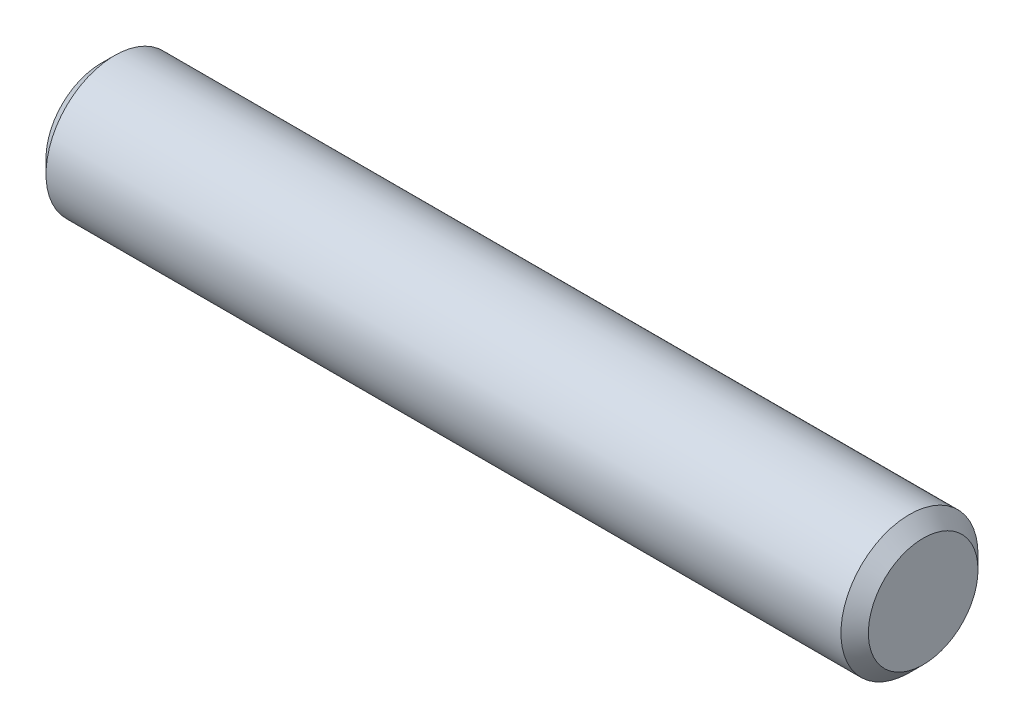
ISO-10303-21;
HEADER;
FILE_DESCRIPTION(('STEP AP214'),'2;1');
FILE_NAME('part.step','',(''),(''),'','','');
FILE_SCHEMA(('AUTOMOTIVE_DESIGN { 1 0 10303 214 1 1 1 1 }'));
ENDSEC;
DATA;
#1=APPLICATION_CONTEXT('core data for automotive mechanical design processes');
#2=APPLICATION_PROTOCOL_DEFINITION('international standard','automotive_design',2000,#1);
#3=PRODUCT_CONTEXT('',#1,'mechanical');
#4=PRODUCT('Part','Part','',(#3));
#5=PRODUCT_RELATED_PRODUCT_CATEGORY('part','',(#4));
#6=PRODUCT_DEFINITION_FORMATION('','',#4);
#7=PRODUCT_DEFINITION_CONTEXT('part definition',#1,'design');
#8=PRODUCT_DEFINITION('design','',#6,#7);
#9=PRODUCT_DEFINITION_SHAPE('','',#8);
#10=(LENGTH_UNIT() NAMED_UNIT(*) SI_UNIT(.MILLI.,.METRE.));
#11=(NAMED_UNIT(*) PLANE_ANGLE_UNIT() SI_UNIT($,.RADIAN.));
#12=(NAMED_UNIT(*) SI_UNIT($,.STERADIAN.) SOLID_ANGLE_UNIT());
#13=UNCERTAINTY_MEASURE_WITH_UNIT(LENGTH_MEASURE(1.E-05),#10,'distance_accuracy_value','');
#14=(GEOMETRIC_REPRESENTATION_CONTEXT(3) GLOBAL_UNCERTAINTY_ASSIGNED_CONTEXT((#13)) GLOBAL_UNIT_ASSIGNED_CONTEXT((#10,
#11,#12)) REPRESENTATION_CONTEXT('',''));
#15=CARTESIAN_POINT('',(0.,0.,0.));
#16=DIRECTION('',(0.,0.,1.));
#17=DIRECTION('',(1.,0.,0.));
#18=AXIS2_PLACEMENT_3D('',#15,#16,#17);
#19=CARTESIAN_POINT('',(-19.05,0.,0.));
#20=DIRECTION('',(1.,0.,0.));
#21=DIRECTION('',(0.,0.,-1.));
#22=AXIS2_PLACEMENT_3D('',#19,#20,#21);
#23=CYLINDRICAL_SURFACE('',#22,3.175);
#24=CARTESIAN_POINT('',(18.415,0.,0.));
#25=DIRECTION('',(1.,0.,0.));
#26=DIRECTION('',(0.,0.,-1.));
#27=AXIS2_PLACEMENT_3D('',#24,#25,#26);
#28=CIRCLE('',#27,3.175);
#29=CARTESIAN_POINT('',(18.415,0.,-3.175));
#30=VERTEX_POINT('',#29);
#31=EDGE_CURVE('E36',#30,#30,#28,.F.);
#32=CARTESIAN_POINT('',(-18.415,0.,0.));
#33=DIRECTION('',(1.,0.,0.));
#34=DIRECTION('',(0.,0.,-1.));
#35=AXIS2_PLACEMENT_3D('',#32,#33,#34);
#36=CIRCLE('',#35,3.175);
#37=CARTESIAN_POINT('',(-18.415,0.,-3.175));
#38=VERTEX_POINT('',#37);
#39=EDGE_CURVE('E40',#38,#38,#36,.T.);
#40=CARTESIAN_POINT('',(18.415,0.,-3.175));
#41=CARTESIAN_POINT('',(18.0313541666667,0.,-3.175));
#42=CARTESIAN_POINT('',(17.6477083333333,0.,-3.175));
#43=CARTESIAN_POINT('',(16.8804166666667,0.,-3.175));
#44=CARTESIAN_POINT('',(16.4967708333333,0.,-3.175));
#45=CARTESIAN_POINT('',(15.7294791666667,0.,-3.175));
#46=CARTESIAN_POINT('',(15.3458333333333,0.,-3.175));
#47=CARTESIAN_POINT('',(14.5785416666667,0.,-3.175));
#48=CARTESIAN_POINT('',(14.1948958333333,0.,-3.175));
#49=CARTESIAN_POINT('',(13.4276041666667,0.,-3.175));
#50=CARTESIAN_POINT('',(13.0439583333333,0.,-3.175));
#51=CARTESIAN_POINT('',(12.2766666666667,0.,-3.175));
#52=CARTESIAN_POINT('',(11.8930208333333,0.,-3.175));
#53=CARTESIAN_POINT('',(11.1257291666667,0.,-3.175));
#54=CARTESIAN_POINT('',(10.7420833333333,0.,-3.175));
#55=CARTESIAN_POINT('',(9.97479166666667,0.,-3.175));
#56=CARTESIAN_POINT('',(9.59114583333334,0.,-3.175));
#57=CARTESIAN_POINT('',(8.82385416666667,0.,-3.175));
#58=CARTESIAN_POINT('',(8.44020833333334,0.,-3.175));
#59=CARTESIAN_POINT('',(7.67291666666667,0.,-3.175));
#60=CARTESIAN_POINT('',(7.28927083333334,0.,-3.175));
#61=CARTESIAN_POINT('',(6.52197916666667,0.,-3.175));
#62=CARTESIAN_POINT('',(6.13833333333334,0.,-3.175));
#63=CARTESIAN_POINT('',(5.37104166666667,0.,-3.175));
#64=CARTESIAN_POINT('',(4.98739583333334,0.,-3.175));
#65=CARTESIAN_POINT('',(4.22010416666667,0.,-3.175));
#66=CARTESIAN_POINT('',(3.83645833333334,0.,-3.175));
#67=CARTESIAN_POINT('',(3.06916666666667,0.,-3.175));
#68=CARTESIAN_POINT('',(2.68552083333334,0.,-3.175));
#69=CARTESIAN_POINT('',(1.91822916666667,0.,-3.175));
#70=CARTESIAN_POINT('',(1.53458333333334,0.,-3.175));
#71=CARTESIAN_POINT('',(0.767291666666671,0.,-3.175));
#72=CARTESIAN_POINT('',(0.383645833333337,0.,-3.175));
#73=CARTESIAN_POINT('',(-0.38364583333333,0.,-3.175));
#74=CARTESIAN_POINT('',(-0.767291666666664,0.,-3.175));
#75=CARTESIAN_POINT('',(-1.53458333333333,0.,-3.175));
#76=CARTESIAN_POINT('',(-1.91822916666666,0.,-3.175));
#77=CARTESIAN_POINT('',(-2.68552083333333,0.,-3.175));
#78=CARTESIAN_POINT('',(-3.06916666666666,0.,-3.175));
#79=CARTESIAN_POINT('',(-3.83645833333333,0.,-3.175));
#80=CARTESIAN_POINT('',(-4.22010416666666,0.,-3.175));
#81=CARTESIAN_POINT('',(-4.98739583333333,0.,-3.175));
#82=CARTESIAN_POINT('',(-5.37104166666666,0.,-3.175));
#83=CARTESIAN_POINT('',(-6.13833333333333,0.,-3.175));
#84=CARTESIAN_POINT('',(-6.52197916666666,0.,-3.175));
#85=CARTESIAN_POINT('',(-7.28927083333333,0.,-3.175));
#86=CARTESIAN_POINT('',(-7.67291666666666,0.,-3.175));
#87=CARTESIAN_POINT('',(-8.44020833333333,0.,-3.175));
#88=CARTESIAN_POINT('',(-8.82385416666667,0.,-3.175));
#89=CARTESIAN_POINT('',(-9.59114583333333,0.,-3.175));
#90=CARTESIAN_POINT('',(-9.97479166666666,0.,-3.175));
#91=CARTESIAN_POINT('',(-10.7420833333333,0.,-3.175));
#92=CARTESIAN_POINT('',(-11.1257291666667,0.,-3.175));
#93=CARTESIAN_POINT('',(-11.8930208333333,0.,-3.175));
#94=CARTESIAN_POINT('',(-12.2766666666667,0.,-3.175));
#95=CARTESIAN_POINT('',(-13.0439583333333,0.,-3.175));
#96=CARTESIAN_POINT('',(-13.4276041666667,0.,-3.175));
#97=CARTESIAN_POINT('',(-14.1948958333333,0.,-3.175));
#98=CARTESIAN_POINT('',(-14.5785416666667,0.,-3.175));
#99=CARTESIAN_POINT('',(-15.3458333333333,0.,-3.175));
#100=CARTESIAN_POINT('',(-15.7294791666667,0.,-3.175));
#101=CARTESIAN_POINT('',(-16.4967708333333,0.,-3.175));
#102=CARTESIAN_POINT('',(-16.8804166666667,0.,-3.175));
#103=CARTESIAN_POINT('',(-17.6477083333333,0.,-3.175));
#104=CARTESIAN_POINT('',(-18.0313541666667,0.,-3.175));
#105=CARTESIAN_POINT('',(-18.415,0.,-3.175));
#106=B_SPLINE_CURVE_WITH_KNOTS('',3,(#40,#41,#42,#43,#44,#45,#46,#47,#48,#49,#50,#51,#52,#53,
#54,#55,#56,#57,#58,#59,#60,#61,#62,#63,#64,#65,#66,#67,#68,#69,#70,#71,#72,#73,#74,#75,#76,#77,
#78,#79,#80,#81,#82,#83,#84,#85,#86,#87,#88,#89,#90,#91,#92,#93,#94,#95,#96,#97,#98,#99,#100,
#101,#102,#103,#104,#105),.UNSPECIFIED.,.F.,.F.,(4,2,2,2,2,2,2,2,2,2,2,2,2,2,2,2,2,2,2,2,2,2,2,
2,2,2,2,2,2,2,2,2,4),(0.,1.1509375,2.301875,3.4528125,4.60375,5.7546875,6.905625,8.0565625,
9.2075,10.3584375,11.509375,12.6603125,13.81125,14.9621875,16.113125,17.2640625,18.415,
19.5659375,20.716875,21.8678125,23.01875,24.1696875,25.320625,26.4715625,27.6225,28.7734375,
29.924375,31.0753125,32.22625,33.3771875,34.528125,35.6790625,36.83),.UNSPECIFIED.);
#107=EDGE_CURVE('BSEAM29',#30,#38,#106,.T.);
#108=ORIENTED_EDGE('',*,*,#31,.T.);
#109=ORIENTED_EDGE('',*,*,#39,.T.);
#110=ORIENTED_EDGE('',*,*,#107,.T.);
#111=ORIENTED_EDGE('',*,*,#107,.F.);
#112=EDGE_LOOP('',(#108,#110,#109,#111));
#113=FACE_BOUND('',#112,.T.);
#114=ADVANCED_FACE('F29',(#113),#23,.T.);
#115=CARTESIAN_POINT('',(-19.05,0.,0.));
#116=DIRECTION('',(1.,0.,0.));
#117=DIRECTION('',(0.,0.,-1.));
#118=AXIS2_PLACEMENT_3D('',#115,#116,#117);
#119=PLANE('',#118);
#120=CARTESIAN_POINT('',(-19.05,0.,0.));
#121=DIRECTION('',(1.,0.,0.));
#122=DIRECTION('',(0.,0.,-1.));
#123=AXIS2_PLACEMENT_3D('',#120,#121,#122);
#124=CIRCLE('',#123,2.53999999999999);
#125=CARTESIAN_POINT('',(-19.05,0.,-2.53999999999999));
#126=VERTEX_POINT('',#125);
#127=EDGE_CURVE('E10',#126,#126,#124,.F.);
#128=ORIENTED_EDGE('',*,*,#127,.T.);
#129=EDGE_LOOP('',(#128));
#130=FACE_BOUND('',#129,.T.);
#131=ADVANCED_FACE('F60',(#130),#119,.F.);
#132=CARTESIAN_POINT('',(19.05,0.,0.));
#133=DIRECTION('',(1.,0.,0.));
#134=DIRECTION('',(0.,0.,-1.));
#135=AXIS2_PLACEMENT_3D('',#132,#133,#134);
#136=PLANE('',#135);
#137=CARTESIAN_POINT('',(19.05,0.,0.));
#138=DIRECTION('',(1.,0.,0.));
#139=DIRECTION('',(0.,0.,-1.));
#140=AXIS2_PLACEMENT_3D('',#137,#138,#139);
#141=CIRCLE('',#140,2.54000000000001);
#142=CARTESIAN_POINT('',(19.05,0.,-2.54000000000001));
#143=VERTEX_POINT('',#142);
#144=EDGE_CURVE('E44',#143,#143,#141,.T.);
#145=ORIENTED_EDGE('',*,*,#144,.T.);
#146=EDGE_LOOP('',(#145));
#147=FACE_BOUND('',#146,.T.);
#148=ADVANCED_FACE('F50',(#147),#136,.T.);
#149=CARTESIAN_POINT('',(19.05,0.,0.));
#150=DIRECTION('',(-1.,0.,0.));
#151=DIRECTION('',(0.,0.,1.));
#152=AXIS2_PLACEMENT_3D('',#149,#150,#151);
#153=CONICAL_SURFACE('',#152,2.54000000000001,0.785398163397451);
#154=ORIENTED_EDGE('',*,*,#31,.F.);
#155=EDGE_LOOP('',(#154));
#156=FACE_BOUND('',#155,.T.);
#157=ORIENTED_EDGE('',*,*,#144,.F.);
#158=EDGE_LOOP('',(#157));
#159=FACE_BOUND('',#158,.T.);
#160=ADVANCED_FACE('F52',(#156,#159),#153,.T.);
#161=CARTESIAN_POINT('',(-18.415,0.,0.));
#162=DIRECTION('',(1.,0.,0.));
#163=DIRECTION('',(0.,0.,-1.));
#164=AXIS2_PLACEMENT_3D('',#161,#162,#163);
#165=CONICAL_SURFACE('',#164,3.175,0.785398163397453);
#166=ORIENTED_EDGE('',*,*,#127,.F.);
#167=EDGE_LOOP('',(#166));
#168=FACE_BOUND('',#167,.T.);
#169=ORIENTED_EDGE('',*,*,#39,.F.);
#170=EDGE_LOOP('',(#169));
#171=FACE_BOUND('',#170,.T.);
#172=ADVANCED_FACE('F31',(#168,#171),#165,.T.);
#173=CLOSED_SHELL('',(#114,#131,#148,#160,#172));
#174=MANIFOLD_SOLID_BREP('B2',#173);
#175=ADVANCED_BREP_SHAPE_REPRESENTATION('',(#18,#174),#14);
#176=SHAPE_DEFINITION_REPRESENTATION(#9,#175);
ENDSEC;
END-ISO-10303-21;
